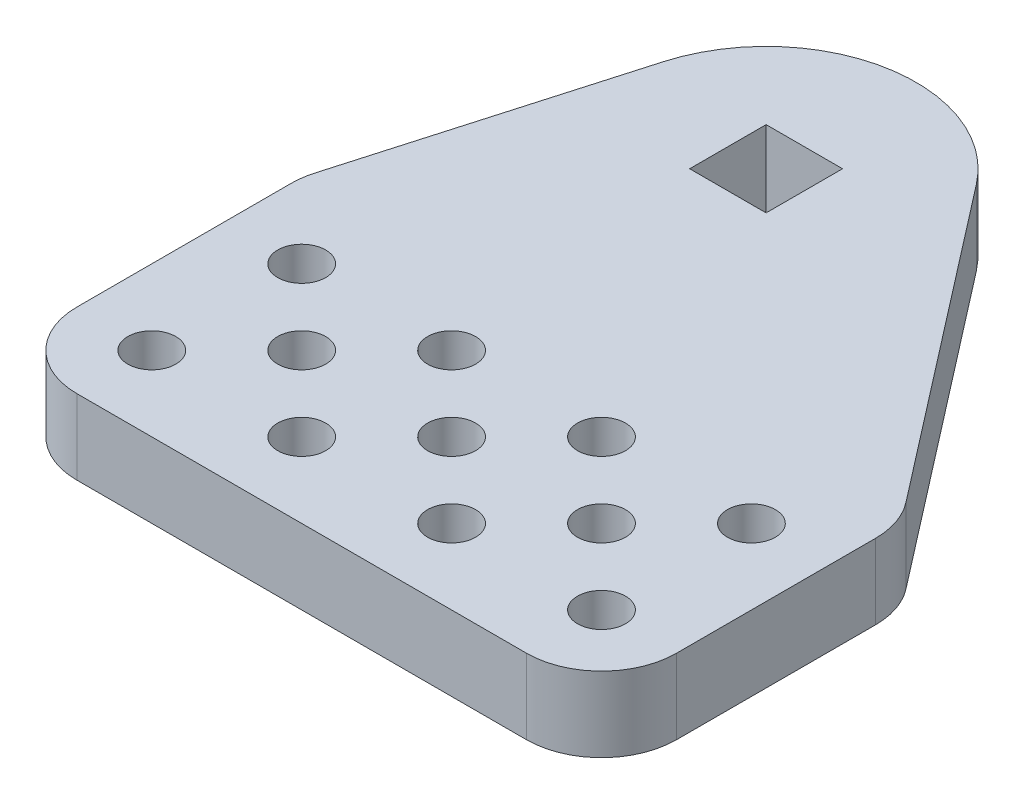
ISO-10303-21;
HEADER;
FILE_DESCRIPTION(('STEP AP214'),'2;1');
FILE_NAME('part.step','',(''),(''),'','','');
FILE_SCHEMA(('AUTOMOTIVE_DESIGN { 1 0 10303 214 1 1 1 1 }'));
ENDSEC;
DATA;
#1=APPLICATION_CONTEXT('core data for automotive mechanical design processes');
#2=APPLICATION_PROTOCOL_DEFINITION('international standard','automotive_design',2000,#1);
#3=PRODUCT_CONTEXT('',#1,'mechanical');
#4=PRODUCT('Part','Part','',(#3));
#5=PRODUCT_RELATED_PRODUCT_CATEGORY('part','',(#4));
#6=PRODUCT_DEFINITION_FORMATION('','',#4);
#7=PRODUCT_DEFINITION_CONTEXT('part definition',#1,'design');
#8=PRODUCT_DEFINITION('design','',#6,#7);
#9=PRODUCT_DEFINITION_SHAPE('','',#8);
#10=(LENGTH_UNIT() NAMED_UNIT(*) SI_UNIT(.MILLI.,.METRE.));
#11=(NAMED_UNIT(*) PLANE_ANGLE_UNIT() SI_UNIT($,.RADIAN.));
#12=(NAMED_UNIT(*) SI_UNIT($,.STERADIAN.) SOLID_ANGLE_UNIT());
#13=UNCERTAINTY_MEASURE_WITH_UNIT(LENGTH_MEASURE(1.E-05),#10,'distance_accuracy_value','');
#14=(GEOMETRIC_REPRESENTATION_CONTEXT(3) GLOBAL_UNCERTAINTY_ASSIGNED_CONTEXT((#13)) GLOBAL_UNIT_ASSIGNED_CONTEXT((#10,
#11,#12)) REPRESENTATION_CONTEXT('',''));
#15=CARTESIAN_POINT('',(0.,0.,0.));
#16=DIRECTION('',(0.,0.,1.));
#17=DIRECTION('',(1.,0.,0.));
#18=AXIS2_PLACEMENT_3D('',#15,#16,#17);
#19=CARTESIAN_POINT('',(19.05,6.35,-45.6955678841871));
#20=DIRECTION('',(0.,-1.,0.));
#21=DIRECTION('',(0.,0.,-1.));
#22=AXIS2_PLACEMENT_3D('',#19,#20,#21);
#23=PLANE('',#22);
#24=DIRECTION('',(-0.276328925998401,0.,0.961063122097904));
#25=VECTOR('',#24,1.);
#26=CARTESIAN_POINT('',(0.,6.35,-25.4));
#27=LINE('',#26,#25);
#28=CARTESIAN_POINT('',(6.84449834935663,6.35,-49.2049452443668));
#29=VERTEX_POINT('',#28);
#30=CARTESIAN_POINT('',(0.247249174678312,6.35,-26.259924681768));
#31=VERTEX_POINT('',#30);
#32=EDGE_CURVE('E193',#29,#31,#27,.T.);
#33=ORIENTED_EDGE('',*,*,#32,.T.);
#34=CARTESIAN_POINT('',(6.35,6.35,-24.5052360016782));
#35=DIRECTION('',(0.,-1.,0.));
#36=DIRECTION('',(0.,0.,-1.));
#37=AXIS2_PLACEMENT_3D('',#34,#35,#36);
#38=CIRCLE('',#37,6.35);
#39=CARTESIAN_POINT('',(0.,6.35,-24.5052360016782));
#40=VERTEX_POINT('',#39);
#41=EDGE_CURVE('E235',#31,#40,#38,.F.);
#42=ORIENTED_EDGE('',*,*,#41,.T.);
#43=DIRECTION('',(0.,0.,1.));
#44=VECTOR('',#43,1.);
#45=CARTESIAN_POINT('',(0.,6.35,0.));
#46=LINE('',#45,#44);
#47=CARTESIAN_POINT('',(0.,6.35,-6.35));
#48=VERTEX_POINT('',#47);
#49=EDGE_CURVE('E180',#40,#48,#46,.T.);
#50=ORIENTED_EDGE('',*,*,#49,.T.);
#51=CARTESIAN_POINT('',(6.35,6.35,-6.35));
#52=DIRECTION('',(0.,-1.,0.));
#53=DIRECTION('',(0.,0.,-1.));
#54=AXIS2_PLACEMENT_3D('',#51,#52,#53);
#55=CIRCLE('',#54,6.35);
#56=CARTESIAN_POINT('',(6.35,6.35,0.));
#57=VERTEX_POINT('',#56);
#58=EDGE_CURVE('E230',#48,#57,#55,.F.);
#59=ORIENTED_EDGE('',*,*,#58,.T.);
#60=DIRECTION('',(1.,0.,0.));
#61=VECTOR('',#60,1.);
#62=CARTESIAN_POINT('',(0.,6.35,0.));
#63=LINE('',#62,#61);
#64=CARTESIAN_POINT('',(44.45,6.35,0.));
#65=VERTEX_POINT('',#64);
#66=EDGE_CURVE('E183',#57,#65,#63,.T.);
#67=ORIENTED_EDGE('',*,*,#66,.T.);
#68=CARTESIAN_POINT('',(44.45,6.35,-6.35));
#69=DIRECTION('',(0.,-1.,0.));
#70=DIRECTION('',(0.,0.,-1.));
#71=AXIS2_PLACEMENT_3D('',#68,#69,#70);
#72=CIRCLE('',#71,6.35);
#73=CARTESIAN_POINT('',(50.8,6.35,-6.35));
#74=VERTEX_POINT('',#73);
#75=EDGE_CURVE('E232',#65,#74,#72,.F.);
#76=ORIENTED_EDGE('',*,*,#75,.T.);
#77=DIRECTION('',(0.,0.,-1.));
#78=VECTOR('',#77,1.);
#79=CARTESIAN_POINT('',(50.8,6.35,0.));
#80=LINE('',#79,#78);
#81=CARTESIAN_POINT('',(50.8,6.35,-23.2310930215419));
#82=VERTEX_POINT('',#81);
#83=EDGE_CURVE('E187',#74,#82,#80,.T.);
#84=ORIENTED_EDGE('',*,*,#83,.T.);
#85=CARTESIAN_POINT('',(44.45,6.35,-23.2310930215419));
#86=DIRECTION('',(0.,-1.,0.));
#87=DIRECTION('',(0.,0.,-1.));
#88=AXIS2_PLACEMENT_3D('',#85,#86,#87);
#89=CIRCLE('',#88,6.35);
#90=CARTESIAN_POINT('',(49.4731682218198,6.35,-27.1157141118542));
#91=VERTEX_POINT('',#90);
#92=EDGE_CURVE('E48',#82,#91,#89,.F.);
#93=ORIENTED_EDGE('',*,*,#92,.T.);
#94=DIRECTION('',(-0.611751352805095,0.,-0.791050113672413));
#95=VECTOR('',#94,1.);
#96=CARTESIAN_POINT('',(29.0963364436396,6.35,-53.4648100648118));
#97=LINE('',#96,#95);
#98=CARTESIAN_POINT('',(29.0963364436396,6.35,-53.4648100648118));
#99=VERTEX_POINT('',#98);
#100=EDGE_CURVE('E189',#91,#99,#97,.T.);
#101=ORIENTED_EDGE('',*,*,#100,.T.);
#102=CARTESIAN_POINT('',(19.05,6.35,-45.6955678841871));
#103=DIRECTION('',(0.,1.,0.));
#104=DIRECTION('',(0.,0.,-1.));
#105=AXIS2_PLACEMENT_3D('',#102,#103,#104);
#106=CIRCLE('',#105,12.7);
#107=EDGE_CURVE('E191',#99,#29,#106,.T.);
#108=ORIENTED_EDGE('',*,*,#107,.T.);
#109=EDGE_LOOP('',(#33,#42,#50,#59,#67,#76,#84,#93,#101,#108));
#110=FACE_BOUND('',#109,.T.);
#111=DIRECTION('',(0.,0.,-1.));
#112=VECTOR('',#111,1.);
#113=CARTESIAN_POINT('',(22.2885,6.35,-42.4570678841871));
#114=LINE('',#113,#112);
#115=CARTESIAN_POINT('',(22.2885,6.35,-42.4570678841871));
#116=VERTEX_POINT('',#115);
#117=CARTESIAN_POINT('',(22.2885,6.35,-48.9340678841871));
#118=VERTEX_POINT('',#117);
#119=EDGE_CURVE('E136',#116,#118,#114,.T.);
#120=ORIENTED_EDGE('',*,*,#119,.F.);
#121=DIRECTION('',(1.,0.,0.));
#122=VECTOR('',#121,1.);
#123=CARTESIAN_POINT('',(15.8115,6.35,-42.4570678841871));
#124=LINE('',#123,#122);
#125=CARTESIAN_POINT('',(15.8115,6.35,-42.4570678841871));
#126=VERTEX_POINT('',#125);
#127=EDGE_CURVE('E162',#126,#116,#124,.T.);
#128=ORIENTED_EDGE('',*,*,#127,.F.);
#129=DIRECTION('',(0.,0.,1.));
#130=VECTOR('',#129,1.);
#131=CARTESIAN_POINT('',(15.8115,6.35,-42.4570678841871));
#132=LINE('',#131,#130);
#133=CARTESIAN_POINT('',(15.8115,6.35,-48.9340678841871));
#134=VERTEX_POINT('',#133);
#135=EDGE_CURVE('E160',#134,#126,#132,.T.);
#136=ORIENTED_EDGE('',*,*,#135,.F.);
#137=DIRECTION('',(-1.,0.,0.));
#138=VECTOR('',#137,1.);
#139=CARTESIAN_POINT('',(15.8115,6.35,-48.9340678841871));
#140=LINE('',#139,#138);
#141=EDGE_CURVE('E146',#118,#134,#140,.T.);
#142=ORIENTED_EDGE('',*,*,#141,.F.);
#143=EDGE_LOOP('',(#120,#128,#136,#142));
#144=FACE_BOUND('',#143,.T.);
#145=CARTESIAN_POINT('',(12.7,6.35,-12.7));
#146=DIRECTION('',(0.,1.,0.));
#147=DIRECTION('',(0.,0.,1.));
#148=AXIS2_PLACEMENT_3D('',#145,#146,#147);
#149=CIRCLE('',#148,2.032);
#150=CARTESIAN_POINT('',(12.7,6.35,-10.668));
#151=VERTEX_POINT('',#150);
#152=EDGE_CURVE('E169',#151,#151,#149,.T.);
#153=ORIENTED_EDGE('',*,*,#152,.F.);
#154=EDGE_LOOP('',(#153));
#155=FACE_BOUND('',#154,.T.);
#156=CARTESIAN_POINT('',(6.35,6.35,-6.35));
#157=DIRECTION('',(0.,1.,0.));
#158=DIRECTION('',(0.,0.,1.));
#159=AXIS2_PLACEMENT_3D('',#156,#157,#158);
#160=CIRCLE('',#159,2.032);
#161=CARTESIAN_POINT('',(6.35,6.35,-4.318));
#162=VERTEX_POINT('',#161);
#163=EDGE_CURVE('E537',#162,#162,#160,.T.);
#164=ORIENTED_EDGE('',*,*,#163,.F.);
#165=EDGE_LOOP('',(#164));
#166=FACE_BOUND('',#165,.T.);
#167=CARTESIAN_POINT('',(19.05,6.35,-6.35));
#168=DIRECTION('',(0.,1.,0.));
#169=DIRECTION('',(0.,0.,1.));
#170=AXIS2_PLACEMENT_3D('',#167,#168,#169);
#171=CIRCLE('',#170,2.032);
#172=CARTESIAN_POINT('',(19.05,6.35,-4.318));
#173=VERTEX_POINT('',#172);
#174=EDGE_CURVE('E544',#173,#173,#171,.T.);
#175=ORIENTED_EDGE('',*,*,#174,.F.);
#176=EDGE_LOOP('',(#175));
#177=FACE_BOUND('',#176,.T.);
#178=CARTESIAN_POINT('',(31.75,6.35,-6.35));
#179=DIRECTION('',(0.,1.,0.));
#180=DIRECTION('',(0.,0.,1.));
#181=AXIS2_PLACEMENT_3D('',#178,#179,#180);
#182=CIRCLE('',#181,2.03199999999999);
#183=CARTESIAN_POINT('',(31.75,6.35,-4.31800000000001));
#184=VERTEX_POINT('',#183);
#185=EDGE_CURVE('E549',#184,#184,#182,.T.);
#186=ORIENTED_EDGE('',*,*,#185,.F.);
#187=EDGE_LOOP('',(#186));
#188=FACE_BOUND('',#187,.T.);
#189=CARTESIAN_POINT('',(44.45,6.35,-6.35));
#190=DIRECTION('',(0.,1.,0.));
#191=DIRECTION('',(0.,0.,1.));
#192=AXIS2_PLACEMENT_3D('',#189,#190,#191);
#193=CIRCLE('',#192,2.032);
#194=CARTESIAN_POINT('',(44.45,6.35,-4.318));
#195=VERTEX_POINT('',#194);
#196=EDGE_CURVE('E555',#195,#195,#193,.T.);
#197=ORIENTED_EDGE('',*,*,#196,.F.);
#198=EDGE_LOOP('',(#197));
#199=FACE_BOUND('',#198,.T.);
#200=CARTESIAN_POINT('',(19.05,6.35,-19.05));
#201=DIRECTION('',(0.,1.,0.));
#202=DIRECTION('',(0.,0.,1.));
#203=AXIS2_PLACEMENT_3D('',#200,#201,#202);
#204=CIRCLE('',#203,2.032);
#205=CARTESIAN_POINT('',(19.05,6.35,-17.018));
#206=VERTEX_POINT('',#205);
#207=EDGE_CURVE('E561',#206,#206,#204,.T.);
#208=ORIENTED_EDGE('',*,*,#207,.F.);
#209=EDGE_LOOP('',(#208));
#210=FACE_BOUND('',#209,.T.);
#211=CARTESIAN_POINT('',(31.75,6.35,-19.05));
#212=DIRECTION('',(0.,1.,0.));
#213=DIRECTION('',(0.,0.,1.));
#214=AXIS2_PLACEMENT_3D('',#211,#212,#213);
#215=CIRCLE('',#214,2.032);
#216=CARTESIAN_POINT('',(31.75,6.35,-17.018));
#217=VERTEX_POINT('',#216);
#218=EDGE_CURVE('E567',#217,#217,#215,.T.);
#219=ORIENTED_EDGE('',*,*,#218,.F.);
#220=EDGE_LOOP('',(#219));
#221=FACE_BOUND('',#220,.T.);
#222=CARTESIAN_POINT('',(44.45,6.35,-19.05));
#223=DIRECTION('',(0.,1.,0.));
#224=DIRECTION('',(0.,0.,1.));
#225=AXIS2_PLACEMENT_3D('',#222,#223,#224);
#226=CIRCLE('',#225,2.032);
#227=CARTESIAN_POINT('',(44.45,6.35,-17.018));
#228=VERTEX_POINT('',#227);
#229=EDGE_CURVE('E573',#228,#228,#226,.T.);
#230=ORIENTED_EDGE('',*,*,#229,.F.);
#231=EDGE_LOOP('',(#230));
#232=FACE_BOUND('',#231,.T.);
#233=CARTESIAN_POINT('',(6.34999999999996,6.35,-19.05));
#234=DIRECTION('',(0.,1.,0.));
#235=DIRECTION('',(0.,0.,1.));
#236=AXIS2_PLACEMENT_3D('',#233,#234,#235);
#237=CIRCLE('',#236,2.032);
#238=CARTESIAN_POINT('',(6.34999999999996,6.35,-17.018));
#239=VERTEX_POINT('',#238);
#240=EDGE_CURVE('E579',#239,#239,#237,.T.);
#241=ORIENTED_EDGE('',*,*,#240,.F.);
#242=EDGE_LOOP('',(#241));
#243=FACE_BOUND('',#242,.T.);
#244=CARTESIAN_POINT('',(25.4,6.35,-12.7));
#245=DIRECTION('',(0.,1.,0.));
#246=DIRECTION('',(0.,0.,1.));
#247=AXIS2_PLACEMENT_3D('',#244,#245,#246);
#248=CIRCLE('',#247,2.032);
#249=CARTESIAN_POINT('',(25.4,6.35,-10.668));
#250=VERTEX_POINT('',#249);
#251=EDGE_CURVE('E585',#250,#250,#248,.T.);
#252=ORIENTED_EDGE('',*,*,#251,.F.);
#253=EDGE_LOOP('',(#252));
#254=FACE_BOUND('',#253,.T.);
#255=CARTESIAN_POINT('',(38.1,6.35,-12.7));
#256=DIRECTION('',(0.,1.,0.));
#257=DIRECTION('',(0.,0.,1.));
#258=AXIS2_PLACEMENT_3D('',#255,#256,#257);
#259=CIRCLE('',#258,2.032);
#260=CARTESIAN_POINT('',(38.1,6.35,-10.668));
#261=VERTEX_POINT('',#260);
#262=EDGE_CURVE('E591',#261,#261,#259,.T.);
#263=ORIENTED_EDGE('',*,*,#262,.F.);
#264=EDGE_LOOP('',(#263));
#265=FACE_BOUND('',#264,.T.);
#266=ADVANCED_FACE('F33',(#110,#144,#155,#166,#177,#188,#199,#210,#221,#232,#243,#254,#265),#23,.F.);
#267=CARTESIAN_POINT('',(19.05,0.,-45.6955678841871));
#268=DIRECTION('',(0.,-1.,0.));
#269=DIRECTION('',(0.,0.,-1.));
#270=AXIS2_PLACEMENT_3D('',#267,#268,#269);
#271=PLANE('',#270);
#272=CARTESIAN_POINT('',(25.4,0.,-12.7));
#273=DIRECTION('',(0.,1.,0.));
#274=DIRECTION('',(0.,0.,1.));
#275=AXIS2_PLACEMENT_3D('',#272,#273,#274);
#276=CIRCLE('',#275,2.032);
#277=CARTESIAN_POINT('',(25.4,0.,-10.668));
#278=VERTEX_POINT('',#277);
#279=EDGE_CURVE('E588',#278,#278,#276,.T.);
#280=ORIENTED_EDGE('',*,*,#279,.T.);
#281=EDGE_LOOP('',(#280));
#282=FACE_BOUND('',#281,.T.);
#283=CARTESIAN_POINT('',(44.45,0.,-19.05));
#284=DIRECTION('',(0.,1.,0.));
#285=DIRECTION('',(0.,0.,1.));
#286=AXIS2_PLACEMENT_3D('',#283,#284,#285);
#287=CIRCLE('',#286,2.032);
#288=CARTESIAN_POINT('',(44.45,0.,-17.018));
#289=VERTEX_POINT('',#288);
#290=EDGE_CURVE('E576',#289,#289,#287,.T.);
#291=ORIENTED_EDGE('',*,*,#290,.T.);
#292=EDGE_LOOP('',(#291));
#293=FACE_BOUND('',#292,.T.);
#294=CARTESIAN_POINT('',(19.05,0.,-19.05));
#295=DIRECTION('',(0.,1.,0.));
#296=DIRECTION('',(0.,0.,1.));
#297=AXIS2_PLACEMENT_3D('',#294,#295,#296);
#298=CIRCLE('',#297,2.032);
#299=CARTESIAN_POINT('',(19.05,0.,-17.018));
#300=VERTEX_POINT('',#299);
#301=EDGE_CURVE('E564',#300,#300,#298,.T.);
#302=ORIENTED_EDGE('',*,*,#301,.T.);
#303=EDGE_LOOP('',(#302));
#304=FACE_BOUND('',#303,.T.);
#305=CARTESIAN_POINT('',(31.75,0.,-6.35));
#306=DIRECTION('',(0.,1.,0.));
#307=DIRECTION('',(0.,0.,1.));
#308=AXIS2_PLACEMENT_3D('',#305,#306,#307);
#309=CIRCLE('',#308,2.03199999999999);
#310=CARTESIAN_POINT('',(31.75,0.,-4.31800000000001));
#311=VERTEX_POINT('',#310);
#312=EDGE_CURVE('E552',#311,#311,#309,.T.);
#313=ORIENTED_EDGE('',*,*,#312,.T.);
#314=EDGE_LOOP('',(#313));
#315=FACE_BOUND('',#314,.T.);
#316=CARTESIAN_POINT('',(6.35,0.,-6.35));
#317=DIRECTION('',(0.,1.,0.));
#318=DIRECTION('',(0.,0.,1.));
#319=AXIS2_PLACEMENT_3D('',#316,#317,#318);
#320=CIRCLE('',#319,2.032);
#321=CARTESIAN_POINT('',(6.35,0.,-4.318));
#322=VERTEX_POINT('',#321);
#323=EDGE_CURVE('E540',#322,#322,#320,.T.);
#324=ORIENTED_EDGE('',*,*,#323,.T.);
#325=EDGE_LOOP('',(#324));
#326=FACE_BOUND('',#325,.T.);
#327=DIRECTION('',(1.,0.,0.));
#328=VECTOR('',#327,1.);
#329=CARTESIAN_POINT('',(15.8115,0.,-42.4570678841871));
#330=LINE('',#329,#328);
#331=CARTESIAN_POINT('',(15.8115,0.,-42.4570678841871));
#332=VERTEX_POINT('',#331);
#333=CARTESIAN_POINT('',(22.2885,0.,-42.4570678841871));
#334=VERTEX_POINT('',#333);
#335=EDGE_CURVE('E147',#332,#334,#330,.T.);
#336=ORIENTED_EDGE('',*,*,#335,.T.);
#337=DIRECTION('',(0.,0.,-1.));
#338=VECTOR('',#337,1.);
#339=CARTESIAN_POINT('',(22.2885,0.,-42.4570678841871));
#340=LINE('',#339,#338);
#341=CARTESIAN_POINT('',(22.2885,0.,-48.9340678841871));
#342=VERTEX_POINT('',#341);
#343=EDGE_CURVE('E167',#334,#342,#340,.T.);
#344=ORIENTED_EDGE('',*,*,#343,.T.);
#345=DIRECTION('',(-1.,0.,0.));
#346=VECTOR('',#345,1.);
#347=CARTESIAN_POINT('',(15.8115,0.,-48.9340678841871));
#348=LINE('',#347,#346);
#349=CARTESIAN_POINT('',(15.8115,0.,-48.9340678841871));
#350=VERTEX_POINT('',#349);
#351=EDGE_CURVE('E153',#342,#350,#348,.T.);
#352=ORIENTED_EDGE('',*,*,#351,.T.);
#353=DIRECTION('',(0.,0.,1.));
#354=VECTOR('',#353,1.);
#355=CARTESIAN_POINT('',(15.8115,0.,-42.4570678841871));
#356=LINE('',#355,#354);
#357=EDGE_CURVE('E171',#350,#332,#356,.T.);
#358=ORIENTED_EDGE('',*,*,#357,.T.);
#359=EDGE_LOOP('',(#336,#344,#352,#358));
#360=FACE_BOUND('',#359,.T.);
#361=DIRECTION('',(0.,0.,1.));
#362=VECTOR('',#361,1.);
#363=CARTESIAN_POINT('',(0.,0.,0.));
#364=LINE('',#363,#362);
#365=CARTESIAN_POINT('',(0.,0.,-24.5052360016782));
#366=VERTEX_POINT('',#365);
#367=CARTESIAN_POINT('',(0.,0.,-6.35));
#368=VERTEX_POINT('',#367);
#369=EDGE_CURVE('E154',#366,#368,#364,.T.);
#370=ORIENTED_EDGE('',*,*,#369,.F.);
#371=CARTESIAN_POINT('',(6.35,0.,-24.5052360016782));
#372=DIRECTION('',(0.,-1.,0.));
#373=DIRECTION('',(0.,0.,-1.));
#374=AXIS2_PLACEMENT_3D('',#371,#372,#373);
#375=CIRCLE('',#374,6.35);
#376=CARTESIAN_POINT('',(0.247249174678312,0.,-26.259924681768));
#377=VERTEX_POINT('',#376);
#378=EDGE_CURVE('E226',#366,#377,#375,.T.);
#379=ORIENTED_EDGE('',*,*,#378,.T.);
#380=DIRECTION('',(-0.276328925998401,0.,0.961063122097904));
#381=VECTOR('',#380,1.);
#382=CARTESIAN_POINT('',(0.,0.,-25.4));
#383=LINE('',#382,#381);
#384=CARTESIAN_POINT('',(6.84449834935663,0.,-49.2049452443668));
#385=VERTEX_POINT('',#384);
#386=EDGE_CURVE('E184',#385,#377,#383,.T.);
#387=ORIENTED_EDGE('',*,*,#386,.F.);
#388=CARTESIAN_POINT('',(19.05,0.,-45.6955678841871));
#389=DIRECTION('',(0.,1.,0.));
#390=DIRECTION('',(0.,0.,-1.));
#391=AXIS2_PLACEMENT_3D('',#388,#389,#390);
#392=CIRCLE('',#391,12.7);
#393=CARTESIAN_POINT('',(29.0963364436396,0.,-53.4648100648118));
#394=VERTEX_POINT('',#393);
#395=EDGE_CURVE('E206',#394,#385,#392,.T.);
#396=ORIENTED_EDGE('',*,*,#395,.F.);
#397=DIRECTION('',(-0.611751352805095,0.,-0.791050113672413));
#398=VECTOR('',#397,1.);
#399=CARTESIAN_POINT('',(29.0963364436396,0.,-53.4648100648118));
#400=LINE('',#399,#398);
#401=CARTESIAN_POINT('',(49.4731682218198,0.,-27.1157141118542));
#402=VERTEX_POINT('',#401);
#403=EDGE_CURVE('E204',#402,#394,#400,.T.);
#404=ORIENTED_EDGE('',*,*,#403,.F.);
#405=CARTESIAN_POINT('',(44.45,0.,-23.2310930215419));
#406=DIRECTION('',(0.,-1.,0.));
#407=DIRECTION('',(0.,0.,-1.));
#408=AXIS2_PLACEMENT_3D('',#405,#406,#407);
#409=CIRCLE('',#408,6.35);
#410=CARTESIAN_POINT('',(50.8,0.,-23.2310930215419));
#411=VERTEX_POINT('',#410);
#412=EDGE_CURVE('E224',#402,#411,#409,.T.);
#413=ORIENTED_EDGE('',*,*,#412,.T.);
#414=DIRECTION('',(0.,0.,-1.));
#415=VECTOR('',#414,1.);
#416=CARTESIAN_POINT('',(50.8,0.,0.));
#417=LINE('',#416,#415);
#418=CARTESIAN_POINT('',(50.8,0.,-6.35));
#419=VERTEX_POINT('',#418);
#420=EDGE_CURVE('E202',#419,#411,#417,.T.);
#421=ORIENTED_EDGE('',*,*,#420,.F.);
#422=CARTESIAN_POINT('',(44.45,0.,-6.35));
#423=DIRECTION('',(0.,-1.,0.));
#424=DIRECTION('',(0.,0.,-1.));
#425=AXIS2_PLACEMENT_3D('',#422,#423,#424);
#426=CIRCLE('',#425,6.35);
#427=CARTESIAN_POINT('',(44.45,0.,0.));
#428=VERTEX_POINT('',#427);
#429=EDGE_CURVE('E222',#419,#428,#426,.T.);
#430=ORIENTED_EDGE('',*,*,#429,.T.);
#431=DIRECTION('',(1.,0.,0.));
#432=VECTOR('',#431,1.);
#433=CARTESIAN_POINT('',(0.,0.,0.));
#434=LINE('',#433,#432);
#435=CARTESIAN_POINT('',(6.35,0.,0.));
#436=VERTEX_POINT('',#435);
#437=EDGE_CURVE('E199',#436,#428,#434,.T.);
#438=ORIENTED_EDGE('',*,*,#437,.F.);
#439=CARTESIAN_POINT('',(6.35,0.,-6.35));
#440=DIRECTION('',(0.,-1.,0.));
#441=DIRECTION('',(0.,0.,-1.));
#442=AXIS2_PLACEMENT_3D('',#439,#440,#441);
#443=CIRCLE('',#442,6.35);
#444=EDGE_CURVE('E220',#436,#368,#443,.T.);
#445=ORIENTED_EDGE('',*,*,#444,.T.);
#446=EDGE_LOOP('',(#370,#379,#387,#396,#404,#413,#421,#430,#438,#445));
#447=FACE_BOUND('',#446,.T.);
#448=CARTESIAN_POINT('',(12.7,0.,-12.7));
#449=DIRECTION('',(0.,1.,0.));
#450=DIRECTION('',(0.,0.,1.));
#451=AXIS2_PLACEMENT_3D('',#448,#449,#450);
#452=CIRCLE('',#451,2.032);
#453=CARTESIAN_POINT('',(12.7,0.,-10.668));
#454=VERTEX_POINT('',#453);
#455=EDGE_CURVE('E536',#454,#454,#452,.T.);
#456=ORIENTED_EDGE('',*,*,#455,.T.);
#457=EDGE_LOOP('',(#456));
#458=FACE_BOUND('',#457,.T.);
#459=CARTESIAN_POINT('',(19.05,0.,-6.35));
#460=DIRECTION('',(0.,1.,0.));
#461=DIRECTION('',(0.,0.,1.));
#462=AXIS2_PLACEMENT_3D('',#459,#460,#461);
#463=CIRCLE('',#462,2.032);
#464=CARTESIAN_POINT('',(19.05,0.,-4.318));
#465=VERTEX_POINT('',#464);
#466=EDGE_CURVE('E546',#465,#465,#463,.T.);
#467=ORIENTED_EDGE('',*,*,#466,.T.);
#468=EDGE_LOOP('',(#467));
#469=FACE_BOUND('',#468,.T.);
#470=CARTESIAN_POINT('',(44.45,0.,-6.35));
#471=DIRECTION('',(0.,1.,0.));
#472=DIRECTION('',(0.,0.,1.));
#473=AXIS2_PLACEMENT_3D('',#470,#471,#472);
#474=CIRCLE('',#473,2.032);
#475=CARTESIAN_POINT('',(44.45,0.,-4.318));
#476=VERTEX_POINT('',#475);
#477=EDGE_CURVE('E558',#476,#476,#474,.T.);
#478=ORIENTED_EDGE('',*,*,#477,.T.);
#479=EDGE_LOOP('',(#478));
#480=FACE_BOUND('',#479,.T.);
#481=CARTESIAN_POINT('',(31.75,0.,-19.05));
#482=DIRECTION('',(0.,1.,0.));
#483=DIRECTION('',(0.,0.,1.));
#484=AXIS2_PLACEMENT_3D('',#481,#482,#483);
#485=CIRCLE('',#484,2.032);
#486=CARTESIAN_POINT('',(31.75,0.,-17.018));
#487=VERTEX_POINT('',#486);
#488=EDGE_CURVE('E570',#487,#487,#485,.T.);
#489=ORIENTED_EDGE('',*,*,#488,.T.);
#490=EDGE_LOOP('',(#489));
#491=FACE_BOUND('',#490,.T.);
#492=CARTESIAN_POINT('',(6.34999999999996,0.,-19.05));
#493=DIRECTION('',(0.,1.,0.));
#494=DIRECTION('',(0.,0.,1.));
#495=AXIS2_PLACEMENT_3D('',#492,#493,#494);
#496=CIRCLE('',#495,2.032);
#497=CARTESIAN_POINT('',(6.34999999999996,0.,-17.018));
#498=VERTEX_POINT('',#497);
#499=EDGE_CURVE('E582',#498,#498,#496,.T.);
#500=ORIENTED_EDGE('',*,*,#499,.T.);
#501=EDGE_LOOP('',(#500));
#502=FACE_BOUND('',#501,.T.);
#503=CARTESIAN_POINT('',(38.1,0.,-12.7));
#504=DIRECTION('',(0.,1.,0.));
#505=DIRECTION('',(0.,0.,1.));
#506=AXIS2_PLACEMENT_3D('',#503,#504,#505);
#507=CIRCLE('',#506,2.032);
#508=CARTESIAN_POINT('',(38.1,0.,-10.668));
#509=VERTEX_POINT('',#508);
#510=EDGE_CURVE('E594',#509,#509,#507,.T.);
#511=ORIENTED_EDGE('',*,*,#510,.T.);
#512=EDGE_LOOP('',(#511));
#513=FACE_BOUND('',#512,.T.);
#514=ADVANCED_FACE('F254',(#282,#293,#304,#315,#326,#360,#447,#458,#469,#480,#491,#502,#513),
#271,.T.);
#515=CARTESIAN_POINT('',(0.,6.35,0.));
#516=DIRECTION('',(1.,0.,0.));
#517=DIRECTION('',(0.,0.,-1.));
#518=AXIS2_PLACEMENT_3D('',#515,#516,#517);
#519=PLANE('',#518);
#520=ORIENTED_EDGE('',*,*,#49,.F.);
#521=DIRECTION('',(0.,-1.,0.));
#522=VECTOR('',#521,1.);
#523=CARTESIAN_POINT('',(0.,6.35,-24.5052360016782));
#524=LINE('',#523,#522);
#525=EDGE_CURVE('E217',#40,#366,#524,.T.);
#526=ORIENTED_EDGE('',*,*,#525,.T.);
#527=ORIENTED_EDGE('',*,*,#369,.T.);
#528=DIRECTION('',(0.,-1.,0.));
#529=VECTOR('',#528,1.);
#530=CARTESIAN_POINT('',(0.,6.35,-6.35));
#531=LINE('',#530,#529);
#532=EDGE_CURVE('E215',#368,#48,#531,.F.);
#533=ORIENTED_EDGE('',*,*,#532,.T.);
#534=EDGE_LOOP('',(#520,#526,#527,#533));
#535=FACE_BOUND('',#534,.T.);
#536=ADVANCED_FACE('F285',(#535),#519,.F.);
#537=CARTESIAN_POINT('',(0.,6.35,0.));
#538=DIRECTION('',(0.,0.,-1.));
#539=DIRECTION('',(-1.,0.,0.));
#540=AXIS2_PLACEMENT_3D('',#537,#538,#539);
#541=PLANE('',#540);
#542=ORIENTED_EDGE('',*,*,#437,.T.);
#543=DIRECTION('',(0.,-1.,0.));
#544=VECTOR('',#543,1.);
#545=CARTESIAN_POINT('',(44.45,6.35,0.));
#546=LINE('',#545,#544);
#547=EDGE_CURVE('E11',#428,#65,#546,.F.);
#548=ORIENTED_EDGE('',*,*,#547,.T.);
#549=ORIENTED_EDGE('',*,*,#66,.F.);
#550=DIRECTION('',(0.,-1.,0.));
#551=VECTOR('',#550,1.);
#552=CARTESIAN_POINT('',(6.35,6.35,0.));
#553=LINE('',#552,#551);
#554=EDGE_CURVE('E41',#57,#436,#553,.T.);
#555=ORIENTED_EDGE('',*,*,#554,.T.);
#556=EDGE_LOOP('',(#542,#548,#549,#555));
#557=FACE_BOUND('',#556,.T.);
#558=ADVANCED_FACE('F248',(#557),#541,.F.);
#559=CARTESIAN_POINT('',(50.8,6.35,0.));
#560=DIRECTION('',(-1.,0.,0.));
#561=DIRECTION('',(0.,0.,1.));
#562=AXIS2_PLACEMENT_3D('',#559,#560,#561);
#563=PLANE('',#562);
#564=ORIENTED_EDGE('',*,*,#420,.T.);
#565=DIRECTION('',(0.,-1.,0.));
#566=VECTOR('',#565,1.);
#567=CARTESIAN_POINT('',(50.8,6.35,-23.2310930215419));
#568=LINE('',#567,#566);
#569=EDGE_CURVE('E56',#411,#82,#568,.F.);
#570=ORIENTED_EDGE('',*,*,#569,.T.);
#571=ORIENTED_EDGE('',*,*,#83,.F.);
#572=DIRECTION('',(0.,-1.,0.));
#573=VECTOR('',#572,1.);
#574=CARTESIAN_POINT('',(50.8,6.35,-6.35));
#575=LINE('',#574,#573);
#576=EDGE_CURVE('E240',#74,#419,#575,.T.);
#577=ORIENTED_EDGE('',*,*,#576,.T.);
#578=EDGE_LOOP('',(#564,#570,#571,#577));
#579=FACE_BOUND('',#578,.T.);
#580=ADVANCED_FACE('F261',(#579),#563,.F.);
#581=CARTESIAN_POINT('',(29.0963364436396,6.35,-53.4648100648118));
#582=DIRECTION('',(-0.791050113672412,0.,0.611751352805095));
#583=DIRECTION('',(0.611751352805095,0.,0.791050113672413));
#584=AXIS2_PLACEMENT_3D('',#581,#582,#583);
#585=PLANE('',#584);
#586=ORIENTED_EDGE('',*,*,#100,.F.);
#587=DIRECTION('',(0.,-1.,0.));
#588=VECTOR('',#587,1.);
#589=CARTESIAN_POINT('',(49.4731682218198,6.35,-27.1157141118542));
#590=LINE('',#589,#588);
#591=EDGE_CURVE('E237',#91,#402,#590,.T.);
#592=ORIENTED_EDGE('',*,*,#591,.T.);
#593=ORIENTED_EDGE('',*,*,#403,.T.);
#594=DIRECTION('',(0.,-1.,0.));
#595=VECTOR('',#594,1.);
#596=CARTESIAN_POINT('',(29.0963364436396,6.35,-53.4648100648118));
#597=LINE('',#596,#595);
#598=EDGE_CURVE('E212',#99,#394,#597,.T.);
#599=ORIENTED_EDGE('',*,*,#598,.F.);
#600=EDGE_LOOP('',(#586,#592,#593,#599));
#601=FACE_BOUND('',#600,.T.);
#602=ADVANCED_FACE('F267',(#601),#585,.F.);
#603=CARTESIAN_POINT('',(19.05,6.35,-45.6955678841871));
#604=DIRECTION('',(0.,-1.,0.));
#605=DIRECTION('',(0.,0.,-1.));
#606=AXIS2_PLACEMENT_3D('',#603,#604,#605);
#607=CYLINDRICAL_SURFACE('',#606,12.7);
#608=ORIENTED_EDGE('',*,*,#395,.T.);
#609=DIRECTION('',(0.,-1.,0.));
#610=VECTOR('',#609,1.);
#611=CARTESIAN_POINT('',(6.84449834935663,6.35,-49.2049452443668));
#612=LINE('',#611,#610);
#613=EDGE_CURVE('E196',#29,#385,#612,.T.);
#614=ORIENTED_EDGE('',*,*,#613,.F.);
#615=ORIENTED_EDGE('',*,*,#107,.F.);
#616=ORIENTED_EDGE('',*,*,#598,.T.);
#617=EDGE_LOOP('',(#608,#614,#615,#616));
#618=FACE_BOUND('',#617,.T.);
#619=ADVANCED_FACE('F273',(#618),#607,.T.);
#620=CARTESIAN_POINT('',(0.,6.35,-25.4));
#621=DIRECTION('',(0.961063122097904,0.,0.276328925998401));
#622=DIRECTION('',(0.276328925998401,0.,-0.961063122097904));
#623=AXIS2_PLACEMENT_3D('',#620,#621,#622);
#624=PLANE('',#623);
#625=ORIENTED_EDGE('',*,*,#386,.T.);
#626=DIRECTION('',(0.,-1.,0.));
#627=VECTOR('',#626,1.);
#628=CARTESIAN_POINT('',(0.247249174678312,6.35,-26.259924681768));
#629=LINE('',#628,#627);
#630=EDGE_CURVE('E228',#377,#31,#629,.F.);
#631=ORIENTED_EDGE('',*,*,#630,.T.);
#632=ORIENTED_EDGE('',*,*,#32,.F.);
#633=ORIENTED_EDGE('',*,*,#613,.T.);
#634=EDGE_LOOP('',(#625,#631,#632,#633));
#635=FACE_BOUND('',#634,.T.);
#636=ADVANCED_FACE('F277',(#635),#624,.F.);
#637=CARTESIAN_POINT('',(22.2885,6.35,-42.4570678841871));
#638=DIRECTION('',(-1.,0.,0.));
#639=DIRECTION('',(0.,0.,1.));
#640=AXIS2_PLACEMENT_3D('',#637,#638,#639);
#641=PLANE('',#640);
#642=ORIENTED_EDGE('',*,*,#343,.F.);
#643=DIRECTION('',(0.,-1.,0.));
#644=VECTOR('',#643,1.);
#645=CARTESIAN_POINT('',(22.2885,6.35,-42.4570678841871));
#646=LINE('',#645,#644);
#647=EDGE_CURVE('E142',#116,#334,#646,.T.);
#648=ORIENTED_EDGE('',*,*,#647,.F.);
#649=ORIENTED_EDGE('',*,*,#119,.T.);
#650=DIRECTION('',(0.,-1.,0.));
#651=VECTOR('',#650,1.);
#652=CARTESIAN_POINT('',(22.2885,6.35,-48.9340678841871));
#653=LINE('',#652,#651);
#654=EDGE_CURVE('E139',#118,#342,#653,.T.);
#655=ORIENTED_EDGE('',*,*,#654,.T.);
#656=EDGE_LOOP('',(#642,#648,#649,#655));
#657=FACE_BOUND('',#656,.T.);
#658=ADVANCED_FACE('F138',(#657),#641,.T.);
#659=CARTESIAN_POINT('',(15.8115,6.35,-48.9340678841871));
#660=DIRECTION('',(0.,0.,1.));
#661=DIRECTION('',(1.,0.,0.));
#662=AXIS2_PLACEMENT_3D('',#659,#660,#661);
#663=PLANE('',#662);
#664=ORIENTED_EDGE('',*,*,#351,.F.);
#665=ORIENTED_EDGE('',*,*,#654,.F.);
#666=ORIENTED_EDGE('',*,*,#141,.T.);
#667=DIRECTION('',(0.,-1.,0.));
#668=VECTOR('',#667,1.);
#669=CARTESIAN_POINT('',(15.8115,6.35,-48.9340678841871));
#670=LINE('',#669,#668);
#671=EDGE_CURVE('E155',#134,#350,#670,.T.);
#672=ORIENTED_EDGE('',*,*,#671,.T.);
#673=EDGE_LOOP('',(#664,#665,#666,#672));
#674=FACE_BOUND('',#673,.T.);
#675=ADVANCED_FACE('F150',(#674),#663,.T.);
#676=CARTESIAN_POINT('',(15.8115,6.35,-42.4570678841871));
#677=DIRECTION('',(1.,0.,0.));
#678=DIRECTION('',(0.,0.,-1.));
#679=AXIS2_PLACEMENT_3D('',#676,#677,#678);
#680=PLANE('',#679);
#681=ORIENTED_EDGE('',*,*,#357,.F.);
#682=ORIENTED_EDGE('',*,*,#671,.F.);
#683=ORIENTED_EDGE('',*,*,#135,.T.);
#684=DIRECTION('',(0.,-1.,0.));
#685=VECTOR('',#684,1.);
#686=CARTESIAN_POINT('',(15.8115,6.35,-42.4570678841871));
#687=LINE('',#686,#685);
#688=EDGE_CURVE('E177',#126,#332,#687,.T.);
#689=ORIENTED_EDGE('',*,*,#688,.T.);
#690=EDGE_LOOP('',(#681,#682,#683,#689));
#691=FACE_BOUND('',#690,.T.);
#692=ADVANCED_FACE('F445',(#691),#680,.T.);
#693=CARTESIAN_POINT('',(15.8115,6.35,-42.4570678841871));
#694=DIRECTION('',(0.,0.,-1.));
#695=DIRECTION('',(-1.,0.,0.));
#696=AXIS2_PLACEMENT_3D('',#693,#694,#695);
#697=PLANE('',#696);
#698=ORIENTED_EDGE('',*,*,#335,.F.);
#699=ORIENTED_EDGE('',*,*,#688,.F.);
#700=ORIENTED_EDGE('',*,*,#127,.T.);
#701=ORIENTED_EDGE('',*,*,#647,.T.);
#702=EDGE_LOOP('',(#698,#699,#700,#701));
#703=FACE_BOUND('',#702,.T.);
#704=ADVANCED_FACE('F436',(#703),#697,.T.);
#705=CARTESIAN_POINT('',(12.7,6.35,-12.7));
#706=DIRECTION('',(0.,-1.,0.));
#707=DIRECTION('',(0.,0.,-1.));
#708=AXIS2_PLACEMENT_3D('',#705,#706,#707);
#709=CYLINDRICAL_SURFACE('',#708,2.032);
#710=ORIENTED_EDGE('',*,*,#152,.T.);
#711=EDGE_LOOP('',(#710));
#712=FACE_BOUND('',#711,.T.);
#713=ORIENTED_EDGE('',*,*,#455,.F.);
#714=EDGE_LOOP('',(#713));
#715=FACE_BOUND('',#714,.T.);
#716=ADVANCED_FACE('F427',(#712,#715),#709,.F.);
#717=CARTESIAN_POINT('',(6.35,6.35,-6.35));
#718=DIRECTION('',(0.,-1.,0.));
#719=DIRECTION('',(0.,0.,-1.));
#720=AXIS2_PLACEMENT_3D('',#717,#718,#719);
#721=CYLINDRICAL_SURFACE('',#720,2.032);
#722=ORIENTED_EDGE('',*,*,#163,.T.);
#723=EDGE_LOOP('',(#722));
#724=FACE_BOUND('',#723,.T.);
#725=ORIENTED_EDGE('',*,*,#323,.F.);
#726=EDGE_LOOP('',(#725));
#727=FACE_BOUND('',#726,.T.);
#728=ADVANCED_FACE('F418',(#724,#727),#721,.F.);
#729=CARTESIAN_POINT('',(19.05,6.35,-6.35));
#730=DIRECTION('',(0.,-1.,0.));
#731=DIRECTION('',(0.,0.,-1.));
#732=AXIS2_PLACEMENT_3D('',#729,#730,#731);
#733=CYLINDRICAL_SURFACE('',#732,2.032);
#734=ORIENTED_EDGE('',*,*,#174,.T.);
#735=EDGE_LOOP('',(#734));
#736=FACE_BOUND('',#735,.T.);
#737=ORIENTED_EDGE('',*,*,#466,.F.);
#738=EDGE_LOOP('',(#737));
#739=FACE_BOUND('',#738,.T.);
#740=ADVANCED_FACE('F409',(#736,#739),#733,.F.);
#741=CARTESIAN_POINT('',(31.75,6.35,-6.35));
#742=DIRECTION('',(0.,-1.,0.));
#743=DIRECTION('',(0.,0.,-1.));
#744=AXIS2_PLACEMENT_3D('',#741,#742,#743);
#745=CYLINDRICAL_SURFACE('',#744,2.03199999999999);
#746=ORIENTED_EDGE('',*,*,#185,.T.);
#747=EDGE_LOOP('',(#746));
#748=FACE_BOUND('',#747,.T.);
#749=ORIENTED_EDGE('',*,*,#312,.F.);
#750=EDGE_LOOP('',(#749));
#751=FACE_BOUND('',#750,.T.);
#752=ADVANCED_FACE('F400',(#748,#751),#745,.F.);
#753=CARTESIAN_POINT('',(44.45,6.35,-6.35));
#754=DIRECTION('',(0.,-1.,0.));
#755=DIRECTION('',(0.,0.,-1.));
#756=AXIS2_PLACEMENT_3D('',#753,#754,#755);
#757=CYLINDRICAL_SURFACE('',#756,2.032);
#758=ORIENTED_EDGE('',*,*,#196,.T.);
#759=EDGE_LOOP('',(#758));
#760=FACE_BOUND('',#759,.T.);
#761=ORIENTED_EDGE('',*,*,#477,.F.);
#762=EDGE_LOOP('',(#761));
#763=FACE_BOUND('',#762,.T.);
#764=ADVANCED_FACE('F391',(#760,#763),#757,.F.);
#765=CARTESIAN_POINT('',(19.05,6.35,-19.05));
#766=DIRECTION('',(0.,-1.,0.));
#767=DIRECTION('',(0.,0.,-1.));
#768=AXIS2_PLACEMENT_3D('',#765,#766,#767);
#769=CYLINDRICAL_SURFACE('',#768,2.032);
#770=ORIENTED_EDGE('',*,*,#207,.T.);
#771=EDGE_LOOP('',(#770));
#772=FACE_BOUND('',#771,.T.);
#773=ORIENTED_EDGE('',*,*,#301,.F.);
#774=EDGE_LOOP('',(#773));
#775=FACE_BOUND('',#774,.T.);
#776=ADVANCED_FACE('F382',(#772,#775),#769,.F.);
#777=CARTESIAN_POINT('',(31.75,6.35,-19.05));
#778=DIRECTION('',(0.,-1.,0.));
#779=DIRECTION('',(0.,0.,-1.));
#780=AXIS2_PLACEMENT_3D('',#777,#778,#779);
#781=CYLINDRICAL_SURFACE('',#780,2.032);
#782=ORIENTED_EDGE('',*,*,#218,.T.);
#783=EDGE_LOOP('',(#782));
#784=FACE_BOUND('',#783,.T.);
#785=ORIENTED_EDGE('',*,*,#488,.F.);
#786=EDGE_LOOP('',(#785));
#787=FACE_BOUND('',#786,.T.);
#788=ADVANCED_FACE('F373',(#784,#787),#781,.F.);
#789=CARTESIAN_POINT('',(44.45,6.35,-19.05));
#790=DIRECTION('',(0.,-1.,0.));
#791=DIRECTION('',(0.,0.,-1.));
#792=AXIS2_PLACEMENT_3D('',#789,#790,#791);
#793=CYLINDRICAL_SURFACE('',#792,2.032);
#794=ORIENTED_EDGE('',*,*,#229,.T.);
#795=EDGE_LOOP('',(#794));
#796=FACE_BOUND('',#795,.T.);
#797=ORIENTED_EDGE('',*,*,#290,.F.);
#798=EDGE_LOOP('',(#797));
#799=FACE_BOUND('',#798,.T.);
#800=ADVANCED_FACE('F364',(#796,#799),#793,.F.);
#801=CARTESIAN_POINT('',(6.34999999999996,6.35,-19.05));
#802=DIRECTION('',(0.,-1.,0.));
#803=DIRECTION('',(0.,0.,-1.));
#804=AXIS2_PLACEMENT_3D('',#801,#802,#803);
#805=CYLINDRICAL_SURFACE('',#804,2.032);
#806=ORIENTED_EDGE('',*,*,#240,.T.);
#807=EDGE_LOOP('',(#806));
#808=FACE_BOUND('',#807,.T.);
#809=ORIENTED_EDGE('',*,*,#499,.F.);
#810=EDGE_LOOP('',(#809));
#811=FACE_BOUND('',#810,.T.);
#812=ADVANCED_FACE('F355',(#808,#811),#805,.F.);
#813=CARTESIAN_POINT('',(25.4,6.35,-12.7));
#814=DIRECTION('',(0.,-1.,0.));
#815=DIRECTION('',(0.,0.,-1.));
#816=AXIS2_PLACEMENT_3D('',#813,#814,#815);
#817=CYLINDRICAL_SURFACE('',#816,2.032);
#818=ORIENTED_EDGE('',*,*,#251,.T.);
#819=EDGE_LOOP('',(#818));
#820=FACE_BOUND('',#819,.T.);
#821=ORIENTED_EDGE('',*,*,#279,.F.);
#822=EDGE_LOOP('',(#821));
#823=FACE_BOUND('',#822,.T.);
#824=ADVANCED_FACE('F346',(#820,#823),#817,.F.);
#825=CARTESIAN_POINT('',(38.1,6.35,-12.7));
#826=DIRECTION('',(0.,-1.,0.));
#827=DIRECTION('',(0.,0.,-1.));
#828=AXIS2_PLACEMENT_3D('',#825,#826,#827);
#829=CYLINDRICAL_SURFACE('',#828,2.032);
#830=ORIENTED_EDGE('',*,*,#262,.T.);
#831=EDGE_LOOP('',(#830));
#832=FACE_BOUND('',#831,.T.);
#833=ORIENTED_EDGE('',*,*,#510,.F.);
#834=EDGE_LOOP('',(#833));
#835=FACE_BOUND('',#834,.T.);
#836=ADVANCED_FACE('F315',(#832,#835),#829,.F.);
#837=CARTESIAN_POINT('',(6.35,6.35,-24.5052360016782));
#838=DIRECTION('',(0.,-1.,0.));
#839=DIRECTION('',(0.,0.,-1.));
#840=AXIS2_PLACEMENT_3D('',#837,#838,#839);
#841=CYLINDRICAL_SURFACE('',#840,6.35);
#842=ORIENTED_EDGE('',*,*,#41,.F.);
#843=ORIENTED_EDGE('',*,*,#630,.F.);
#844=ORIENTED_EDGE('',*,*,#378,.F.);
#845=ORIENTED_EDGE('',*,*,#525,.F.);
#846=EDGE_LOOP('',(#842,#843,#844,#845));
#847=FACE_BOUND('',#846,.T.);
#848=ADVANCED_FACE('F283',(#847),#841,.T.);
#849=CARTESIAN_POINT('',(44.45,6.35,-23.2310930215419));
#850=DIRECTION('',(0.,-1.,0.));
#851=DIRECTION('',(0.,0.,-1.));
#852=AXIS2_PLACEMENT_3D('',#849,#850,#851);
#853=CYLINDRICAL_SURFACE('',#852,6.35);
#854=ORIENTED_EDGE('',*,*,#92,.F.);
#855=ORIENTED_EDGE('',*,*,#569,.F.);
#856=ORIENTED_EDGE('',*,*,#412,.F.);
#857=ORIENTED_EDGE('',*,*,#591,.F.);
#858=EDGE_LOOP('',(#854,#855,#856,#857));
#859=FACE_BOUND('',#858,.T.);
#860=ADVANCED_FACE('F264',(#859),#853,.T.);
#861=CARTESIAN_POINT('',(44.45,6.35,-6.35));
#862=DIRECTION('',(0.,-1.,0.));
#863=DIRECTION('',(0.,0.,-1.));
#864=AXIS2_PLACEMENT_3D('',#861,#862,#863);
#865=CYLINDRICAL_SURFACE('',#864,6.35);
#866=ORIENTED_EDGE('',*,*,#75,.F.);
#867=ORIENTED_EDGE('',*,*,#547,.F.);
#868=ORIENTED_EDGE('',*,*,#429,.F.);
#869=ORIENTED_EDGE('',*,*,#576,.F.);
#870=EDGE_LOOP('',(#866,#867,#868,#869));
#871=FACE_BOUND('',#870,.T.);
#872=ADVANCED_FACE('F260',(#871),#865,.T.);
#873=CARTESIAN_POINT('',(6.35,6.35,-6.35));
#874=DIRECTION('',(0.,-1.,0.));
#875=DIRECTION('',(0.,0.,-1.));
#876=AXIS2_PLACEMENT_3D('',#873,#874,#875);
#877=CYLINDRICAL_SURFACE('',#876,6.35);
#878=ORIENTED_EDGE('',*,*,#58,.F.);
#879=ORIENTED_EDGE('',*,*,#532,.F.);
#880=ORIENTED_EDGE('',*,*,#444,.F.);
#881=ORIENTED_EDGE('',*,*,#554,.F.);
#882=EDGE_LOOP('',(#878,#879,#880,#881));
#883=FACE_BOUND('',#882,.T.);
#884=ADVANCED_FACE('F35',(#883),#877,.T.);
#885=CLOSED_SHELL('',(#266,#514,#536,#558,#580,#602,#619,#636,#658,#675,#692,#704,#716,#728,
#740,#752,#764,#776,#788,#800,#812,#824,#836,#848,#860,#872,#884));
#886=MANIFOLD_SOLID_BREP('B2',#885);
#887=ADVANCED_BREP_SHAPE_REPRESENTATION('',(#18,#886),#14);
#888=SHAPE_DEFINITION_REPRESENTATION(#9,#887);
ENDSEC;
END-ISO-10303-21;
